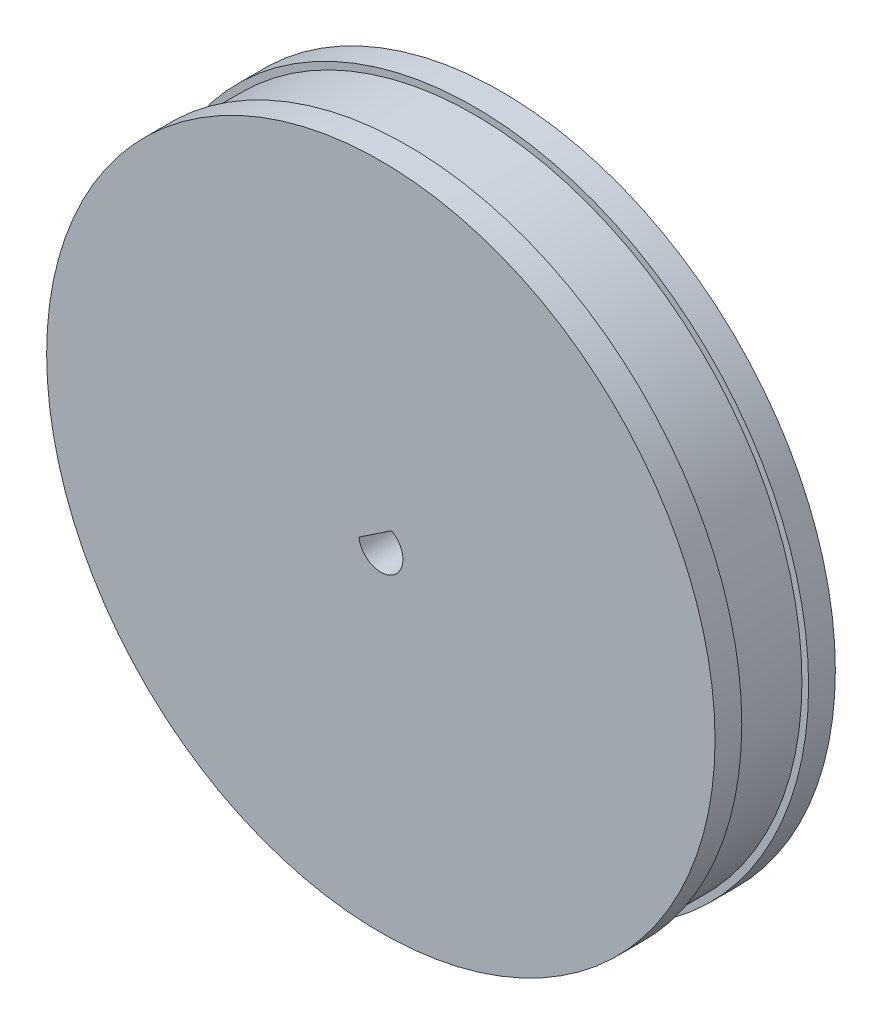
ISO-10303-21;
HEADER;
FILE_DESCRIPTION(('STEP AP214'),'2;1');
FILE_NAME('part.step','',(''),(''),'','','');
FILE_SCHEMA(('AUTOMOTIVE_DESIGN { 1 0 10303 214 1 1 1 1 }'));
ENDSEC;
DATA;
#1=APPLICATION_CONTEXT('core data for automotive mechanical design processes');
#2=APPLICATION_PROTOCOL_DEFINITION('international standard','automotive_design',2000,#1);
#3=PRODUCT_CONTEXT('',#1,'mechanical');
#4=PRODUCT('Part','Part','',(#3));
#5=PRODUCT_RELATED_PRODUCT_CATEGORY('part','',(#4));
#6=PRODUCT_DEFINITION_FORMATION('','',#4);
#7=PRODUCT_DEFINITION_CONTEXT('part definition',#1,'design');
#8=PRODUCT_DEFINITION('design','',#6,#7);
#9=PRODUCT_DEFINITION_SHAPE('','',#8);
#10=(LENGTH_UNIT() NAMED_UNIT(*) SI_UNIT(.MILLI.,.METRE.));
#11=(NAMED_UNIT(*) PLANE_ANGLE_UNIT() SI_UNIT($,.RADIAN.));
#12=(NAMED_UNIT(*) SI_UNIT($,.STERADIAN.) SOLID_ANGLE_UNIT());
#13=UNCERTAINTY_MEASURE_WITH_UNIT(LENGTH_MEASURE(1.E-05),#10,'distance_accuracy_value','');
#14=(GEOMETRIC_REPRESENTATION_CONTEXT(3) GLOBAL_UNCERTAINTY_ASSIGNED_CONTEXT((#13)) GLOBAL_UNIT_ASSIGNED_CONTEXT((#10,
#11,#12)) REPRESENTATION_CONTEXT('',''));
#15=CARTESIAN_POINT('',(0.,0.,0.));
#16=DIRECTION('',(0.,0.,1.));
#17=DIRECTION('',(1.,0.,0.));
#18=AXIS2_PLACEMENT_3D('',#15,#16,#17);
#19=CARTESIAN_POINT('',(0.,0.,5.));
#20=DIRECTION('',(0.,0.,-1.));
#21=DIRECTION('',(-1.,0.,0.));
#22=AXIS2_PLACEMENT_3D('',#19,#20,#21);
#23=CYLINDRICAL_SURFACE('',#22,24.5);
#24=CARTESIAN_POINT('',(0.,0.,5.));
#25=DIRECTION('',(0.,0.,1.));
#26=DIRECTION('',(1.,0.,0.));
#27=AXIS2_PLACEMENT_3D('',#24,#25,#26);
#28=CIRCLE('',#27,24.5);
#29=CARTESIAN_POINT('',(24.5,0.,5.));
#30=VERTEX_POINT('',#29);
#31=EDGE_CURVE('E11',#30,#30,#28,.T.);
#32=ORIENTED_EDGE('',*,*,#31,.F.);
#33=EDGE_LOOP('',(#32));
#34=FACE_BOUND('',#33,.T.);
#35=CARTESIAN_POINT('',(0.,0.,0.));
#36=DIRECTION('',(0.,0.,1.));
#37=DIRECTION('',(1.,0.,0.));
#38=AXIS2_PLACEMENT_3D('',#35,#36,#37);
#39=CIRCLE('',#38,24.5);
#40=CARTESIAN_POINT('',(24.5,0.,0.));
#41=VERTEX_POINT('',#40);
#42=EDGE_CURVE('E38',#41,#41,#39,.T.);
#43=ORIENTED_EDGE('',*,*,#42,.T.);
#44=EDGE_LOOP('',(#43));
#45=FACE_BOUND('',#44,.T.);
#46=ADVANCED_FACE('F35',(#34,#45),#23,.T.);
#47=CARTESIAN_POINT('',(0.,0.,-2.));
#48=DIRECTION('',(0.,0.,1.));
#49=DIRECTION('',(1.,0.,0.));
#50=AXIS2_PLACEMENT_3D('',#47,#48,#49);
#51=CYLINDRICAL_SURFACE('',#50,25.);
#52=CARTESIAN_POINT('',(0.,0.,-2.));
#53=DIRECTION('',(0.,0.,-1.));
#54=DIRECTION('',(-1.,0.,0.));
#55=AXIS2_PLACEMENT_3D('',#52,#53,#54);
#56=CIRCLE('',#55,25.);
#57=CARTESIAN_POINT('',(-25.,0.,-2.));
#58=VERTEX_POINT('',#57);
#59=EDGE_CURVE('E86',#58,#58,#56,.T.);
#60=ORIENTED_EDGE('',*,*,#59,.F.);
#61=EDGE_LOOP('',(#60));
#62=FACE_BOUND('',#61,.T.);
#63=CARTESIAN_POINT('',(0.,0.,0.));
#64=DIRECTION('',(0.,0.,-1.));
#65=DIRECTION('',(-1.,0.,0.));
#66=AXIS2_PLACEMENT_3D('',#63,#64,#65);
#67=CIRCLE('',#66,25.);
#68=CARTESIAN_POINT('',(-25.,0.,0.));
#69=VERTEX_POINT('',#68);
#70=EDGE_CURVE('E84',#69,#69,#67,.T.);
#71=ORIENTED_EDGE('',*,*,#70,.T.);
#72=EDGE_LOOP('',(#71));
#73=FACE_BOUND('',#72,.T.);
#74=ADVANCED_FACE('F92',(#62,#73),#51,.T.);
#75=CARTESIAN_POINT('',(0.,0.,-2.));
#76=DIRECTION('',(0.,0.,-1.));
#77=DIRECTION('',(-1.,0.,0.));
#78=AXIS2_PLACEMENT_3D('',#75,#76,#77);
#79=PLANE('',#78);
#80=CARTESIAN_POINT('',(0.,0.,-2.));
#81=DIRECTION('',(0.,0.,-1.));
#82=DIRECTION('',(-1.,0.,0.));
#83=AXIS2_PLACEMENT_3D('',#80,#81,#82);
#84=CIRCLE('',#83,1.65);
#85=CARTESIAN_POINT('',(0.803526302302825,1.44112646270463,-2.));
#86=VERTEX_POINT('',#85);
#87=CARTESIAN_POINT('',(-1.63844088430939,-0.19496530107552,-2.));
#88=VERTEX_POINT('',#87);
#89=EDGE_CURVE('E71',#86,#88,#84,.T.);
#90=ORIENTED_EDGE('',*,*,#89,.F.);
#91=DIRECTION('',(0.830774107752738,0.556609721337709,0.));
#92=VECTOR('',#91,1.);
#93=CARTESIAN_POINT('',(-1.63844088430939,-0.19496530107552,-2.));
#94=LINE('',#93,#92);
#95=EDGE_CURVE('E56',#88,#86,#94,.T.);
#96=ORIENTED_EDGE('',*,*,#95,.F.);
#97=EDGE_LOOP('',(#90,#96));
#98=FACE_BOUND('',#97,.T.);
#99=ORIENTED_EDGE('',*,*,#59,.T.);
#100=EDGE_LOOP('',(#99));
#101=FACE_BOUND('',#100,.T.);
#102=ADVANCED_FACE('F97',(#98,#101),#79,.T.);
#103=CARTESIAN_POINT('',(0.,0.,0.));
#104=DIRECTION('',(0.,0.,-1.));
#105=DIRECTION('',(-1.,0.,0.));
#106=AXIS2_PLACEMENT_3D('',#103,#104,#105);
#107=PLANE('',#106);
#108=ORIENTED_EDGE('',*,*,#42,.F.);
#109=EDGE_LOOP('',(#108));
#110=FACE_BOUND('',#109,.T.);
#111=ORIENTED_EDGE('',*,*,#70,.F.);
#112=EDGE_LOOP('',(#111));
#113=FACE_BOUND('',#112,.T.);
#114=ADVANCED_FACE('F94',(#110,#113),#107,.F.);
#115=CARTESIAN_POINT('',(0.,0.,7.));
#116=DIRECTION('',(0.,0.,-1.));
#117=DIRECTION('',(-1.,0.,0.));
#118=AXIS2_PLACEMENT_3D('',#115,#116,#117);
#119=CYLINDRICAL_SURFACE('',#118,25.);
#120=CARTESIAN_POINT('',(0.,0.,7.));
#121=DIRECTION('',(0.,0.,1.));
#122=DIRECTION('',(1.,0.,0.));
#123=AXIS2_PLACEMENT_3D('',#120,#121,#122);
#124=CIRCLE('',#123,25.);
#125=CARTESIAN_POINT('',(25.,0.,7.));
#126=VERTEX_POINT('',#125);
#127=EDGE_CURVE('E78',#126,#126,#124,.T.);
#128=ORIENTED_EDGE('',*,*,#127,.F.);
#129=EDGE_LOOP('',(#128));
#130=FACE_BOUND('',#129,.T.);
#131=CARTESIAN_POINT('',(0.,0.,5.));
#132=DIRECTION('',(0.,0.,1.));
#133=DIRECTION('',(1.,0.,0.));
#134=AXIS2_PLACEMENT_3D('',#131,#132,#133);
#135=CIRCLE('',#134,25.);
#136=CARTESIAN_POINT('',(25.,0.,5.));
#137=VERTEX_POINT('',#136);
#138=EDGE_CURVE('E75',#137,#137,#135,.T.);
#139=ORIENTED_EDGE('',*,*,#138,.T.);
#140=EDGE_LOOP('',(#139));
#141=FACE_BOUND('',#140,.T.);
#142=ADVANCED_FACE('F96',(#130,#141),#119,.T.);
#143=CARTESIAN_POINT('',(0.,0.,7.));
#144=DIRECTION('',(0.,0.,1.));
#145=DIRECTION('',(1.,0.,0.));
#146=AXIS2_PLACEMENT_3D('',#143,#144,#145);
#147=PLANE('',#146);
#148=CARTESIAN_POINT('',(0.,0.,7.));
#149=DIRECTION('',(0.,0.,-1.));
#150=DIRECTION('',(-1.,0.,0.));
#151=AXIS2_PLACEMENT_3D('',#148,#149,#150);
#152=CIRCLE('',#151,1.65);
#153=CARTESIAN_POINT('',(0.803526302302825,1.44112646270463,7.));
#154=VERTEX_POINT('',#153);
#155=CARTESIAN_POINT('',(-1.63844088430939,-0.19496530107552,7.));
#156=VERTEX_POINT('',#155);
#157=EDGE_CURVE('E69',#154,#156,#152,.T.);
#158=ORIENTED_EDGE('',*,*,#157,.T.);
#159=DIRECTION('',(0.830774107752738,0.556609721337709,0.));
#160=VECTOR('',#159,1.);
#161=CARTESIAN_POINT('',(-1.63844088430939,-0.19496530107552,7.));
#162=LINE('',#161,#160);
#163=EDGE_CURVE('E48',#156,#154,#162,.T.);
#164=ORIENTED_EDGE('',*,*,#163,.T.);
#165=EDGE_LOOP('',(#158,#164));
#166=FACE_BOUND('',#165,.T.);
#167=ORIENTED_EDGE('',*,*,#127,.T.);
#168=EDGE_LOOP('',(#167));
#169=FACE_BOUND('',#168,.T.);
#170=ADVANCED_FACE('F73',(#166,#169),#147,.T.);
#171=CARTESIAN_POINT('',(0.,0.,5.));
#172=DIRECTION('',(0.,0.,1.));
#173=DIRECTION('',(1.,0.,0.));
#174=AXIS2_PLACEMENT_3D('',#171,#172,#173);
#175=PLANE('',#174);
#176=ORIENTED_EDGE('',*,*,#31,.T.);
#177=EDGE_LOOP('',(#176));
#178=FACE_BOUND('',#177,.T.);
#179=ORIENTED_EDGE('',*,*,#138,.F.);
#180=EDGE_LOOP('',(#179));
#181=FACE_BOUND('',#180,.T.);
#182=ADVANCED_FACE('F119',(#178,#181),#175,.F.);
#183=CARTESIAN_POINT('',(0.,0.,7.));
#184=DIRECTION('',(0.,0.,-1.));
#185=DIRECTION('',(-1.,0.,0.));
#186=AXIS2_PLACEMENT_3D('',#183,#184,#185);
#187=CYLINDRICAL_SURFACE('',#186,1.65);
#188=ORIENTED_EDGE('',*,*,#89,.T.);
#189=DIRECTION('',(0.,0.,1.));
#190=VECTOR('',#189,1.);
#191=CARTESIAN_POINT('',(-1.63844088430939,-0.19496530107552,-2.));
#192=LINE('',#191,#190);
#193=EDGE_CURVE('E62',#88,#156,#192,.T.);
#194=ORIENTED_EDGE('',*,*,#193,.T.);
#195=ORIENTED_EDGE('',*,*,#157,.F.);
#196=DIRECTION('',(0.,0.,1.));
#197=VECTOR('',#196,1.);
#198=CARTESIAN_POINT('',(0.803526302302825,1.44112646270463,-2.));
#199=LINE('',#198,#197);
#200=EDGE_CURVE('E63',#86,#154,#199,.T.);
#201=ORIENTED_EDGE('',*,*,#200,.F.);
#202=EDGE_LOOP('',(#188,#194,#195,#201));
#203=FACE_BOUND('',#202,.T.);
#204=ADVANCED_FACE('F68',(#203),#187,.F.);
#205=CARTESIAN_POINT('',(-1.63844088430939,-0.19496530107552,-2.));
#206=DIRECTION('',(0.556609721337709,-0.830774107752738,0.));
#207=DIRECTION('',(0.830774107752738,0.556609721337709,0.));
#208=AXIS2_PLACEMENT_3D('',#205,#206,#207);
#209=PLANE('',#208);
#210=ORIENTED_EDGE('',*,*,#163,.F.);
#211=ORIENTED_EDGE('',*,*,#193,.F.);
#212=ORIENTED_EDGE('',*,*,#95,.T.);
#213=ORIENTED_EDGE('',*,*,#200,.T.);
#214=EDGE_LOOP('',(#210,#211,#212,#213));
#215=FACE_BOUND('',#214,.T.);
#216=ADVANCED_FACE('F61',(#215),#209,.T.);
#217=CLOSED_SHELL('',(#46,#74,#102,#114,#142,#170,#182,#204,#216));
#218=MANIFOLD_SOLID_BREP('B2',#217);
#219=ADVANCED_BREP_SHAPE_REPRESENTATION('',(#18,#218),#14);
#220=SHAPE_DEFINITION_REPRESENTATION(#9,#219);
ENDSEC;
END-ISO-10303-21;
